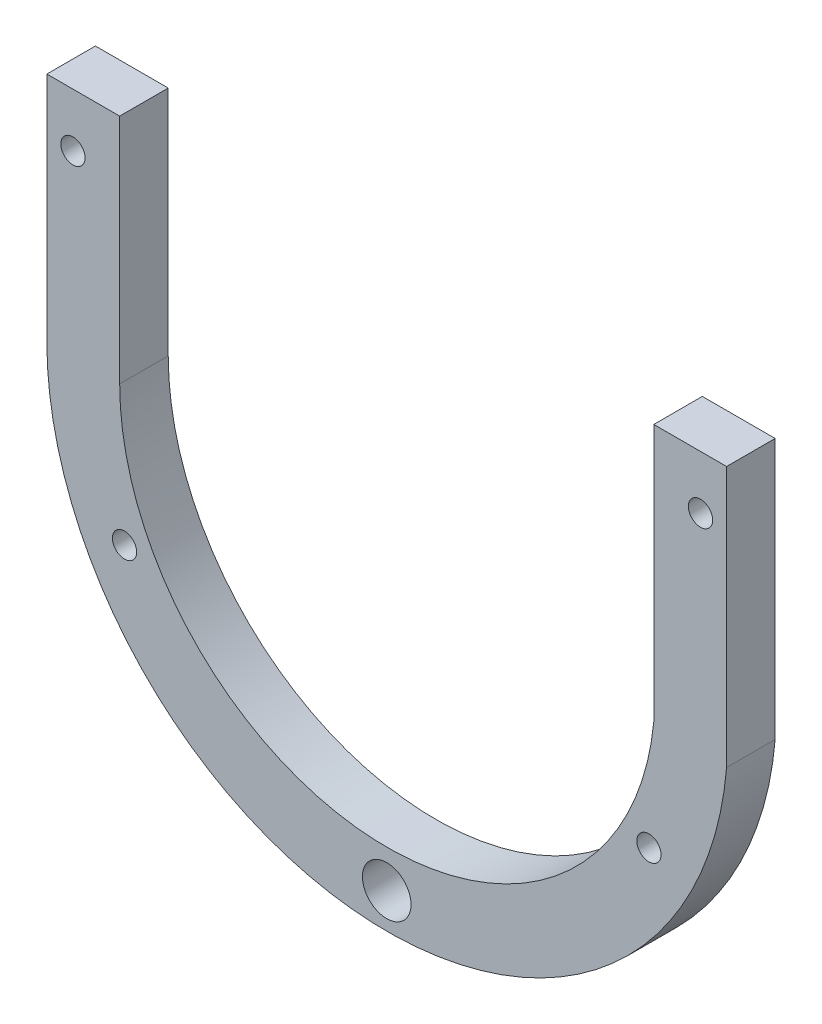
ISO-10303-21;
HEADER;
FILE_DESCRIPTION(('STEP AP214'),'2;1');
FILE_NAME('part.step','',(''),(''),'','','');
FILE_SCHEMA(('AUTOMOTIVE_DESIGN { 1 0 10303 214 1 1 1 1 }'));
ENDSEC;
DATA;
#1=APPLICATION_CONTEXT('core data for automotive mechanical design processes');
#2=APPLICATION_PROTOCOL_DEFINITION('international standard','automotive_design',2000,#1);
#3=PRODUCT_CONTEXT('',#1,'mechanical');
#4=PRODUCT('Part','Part','',(#3));
#5=PRODUCT_RELATED_PRODUCT_CATEGORY('part','',(#4));
#6=PRODUCT_DEFINITION_FORMATION('','',#4);
#7=PRODUCT_DEFINITION_CONTEXT('part definition',#1,'design');
#8=PRODUCT_DEFINITION('design','',#6,#7);
#9=PRODUCT_DEFINITION_SHAPE('','',#8);
#10=(LENGTH_UNIT() NAMED_UNIT(*) SI_UNIT(.MILLI.,.METRE.));
#11=(NAMED_UNIT(*) PLANE_ANGLE_UNIT() SI_UNIT($,.RADIAN.));
#12=(NAMED_UNIT(*) SI_UNIT($,.STERADIAN.) SOLID_ANGLE_UNIT());
#13=UNCERTAINTY_MEASURE_WITH_UNIT(LENGTH_MEASURE(1.E-05),#10,'distance_accuracy_value','');
#14=(GEOMETRIC_REPRESENTATION_CONTEXT(3) GLOBAL_UNCERTAINTY_ASSIGNED_CONTEXT((#13)) GLOBAL_UNIT_ASSIGNED_CONTEXT((#10,
#11,#12)) REPRESENTATION_CONTEXT('',''));
#15=CARTESIAN_POINT('',(0.,0.,0.));
#16=DIRECTION('',(0.,0.,1.));
#17=DIRECTION('',(1.,0.,0.));
#18=AXIS2_PLACEMENT_3D('',#15,#16,#17);
#19=CARTESIAN_POINT('',(0.,96.2099125364432,8.));
#20=DIRECTION('',(0.,-1.,0.));
#21=DIRECTION('',(0.,0.,-1.));
#22=AXIS2_PLACEMENT_3D('',#19,#20,#21);
#23=PLANE('',#22);
#24=DIRECTION('',(0.,0.,1.));
#25=VECTOR('',#24,1.);
#26=CARTESIAN_POINT('',(44.0000000000009,96.2099125364472,0.));
#27=LINE('',#26,#25);
#28=CARTESIAN_POINT('',(44.0000000000009,96.2099125364472,0.));
#29=VERTEX_POINT('',#28);
#30=CARTESIAN_POINT('',(44.0000000000009,96.2099125364472,8.));
#31=VERTEX_POINT('',#30);
#32=EDGE_CURVE('E147',#29,#31,#27,.T.);
#33=ORIENTED_EDGE('',*,*,#32,.T.);
#34=DIRECTION('',(-1.,0.,0.));
#35=VECTOR('',#34,1.);
#36=CARTESIAN_POINT('',(0.,96.2099125364432,8.));
#37=LINE('',#36,#35);
#38=CARTESIAN_POINT('',(56.0000000000009,96.2099125364472,8.));
#39=VERTEX_POINT('',#38);
#40=EDGE_CURVE('E43',#39,#31,#37,.T.);
#41=ORIENTED_EDGE('',*,*,#40,.F.);
#42=DIRECTION('',(0.,0.,1.));
#43=VECTOR('',#42,1.);
#44=CARTESIAN_POINT('',(56.0000000000009,96.2099125364472,0.));
#45=LINE('',#44,#43);
#46=CARTESIAN_POINT('',(56.0000000000009,96.2099125364472,0.));
#47=VERTEX_POINT('',#46);
#48=EDGE_CURVE('E150',#47,#39,#45,.T.);
#49=ORIENTED_EDGE('',*,*,#48,.F.);
#50=DIRECTION('',(-1.,0.,0.));
#51=VECTOR('',#50,1.);
#52=CARTESIAN_POINT('',(0.,96.2099125364432,0.));
#53=LINE('',#52,#51);
#54=EDGE_CURVE('E38',#47,#29,#53,.T.);
#55=ORIENTED_EDGE('',*,*,#54,.T.);
#56=EDGE_LOOP('',(#33,#41,#49,#55));
#57=FACE_BOUND('',#56,.T.);
#58=ADVANCED_FACE('F35',(#57),#23,.F.);
#59=DIRECTION('',(0.,0.,1.));
#60=VECTOR('',#59,1.);
#61=CARTESIAN_POINT('',(144.000000000001,96.2099125364472,0.));
#62=LINE('',#61,#60);
#63=CARTESIAN_POINT('',(144.000000000001,96.2099125364432,0.));
#64=VERTEX_POINT('',#63);
#65=CARTESIAN_POINT('',(144.000000000001,96.2099125364472,8.));
#66=VERTEX_POINT('',#65);
#67=EDGE_CURVE('E58',#64,#66,#62,.T.);
#68=ORIENTED_EDGE('',*,*,#67,.T.);
#69=CARTESIAN_POINT('',(156.000000000001,96.2099125364472,8.));
#70=VERTEX_POINT('',#69);
#71=EDGE_CURVE('E12',#70,#66,#37,.T.);
#72=ORIENTED_EDGE('',*,*,#71,.F.);
#73=DIRECTION('',(0.,0.,1.));
#74=VECTOR('',#73,1.);
#75=CARTESIAN_POINT('',(156.000000000001,96.2099125364472,0.));
#76=LINE('',#75,#74);
#77=CARTESIAN_POINT('',(156.000000000001,96.2099125364472,0.));
#78=VERTEX_POINT('',#77);
#79=EDGE_CURVE('E154',#78,#70,#76,.T.);
#80=ORIENTED_EDGE('',*,*,#79,.F.);
#81=EDGE_CURVE('E157',#78,#64,#53,.T.);
#82=ORIENTED_EDGE('',*,*,#81,.T.);
#83=EDGE_LOOP('',(#68,#72,#80,#82));
#84=FACE_BOUND('',#83,.T.);
#85=ADVANCED_FACE('F176',(#84),#23,.F.);
#86=CARTESIAN_POINT('',(0.,0.,8.));
#87=DIRECTION('',(0.,0.,-1.));
#88=DIRECTION('',(-1.,0.,0.));
#89=AXIS2_PLACEMENT_3D('',#86,#87,#88);
#90=PLANE('',#89);
#91=CARTESIAN_POINT('',(100.000000000001,7.69234039701383,8.));
#92=DIRECTION('',(0.,0.,-1.));
#93=DIRECTION('',(-1.,0.,0.));
#94=AXIS2_PLACEMENT_3D('',#91,#92,#93);
#95=CIRCLE('',#94,4.00000000000001);
#96=CARTESIAN_POINT('',(96.000000000001,7.69234039701383,8.));
#97=VERTEX_POINT('',#96);
#98=EDGE_CURVE('E202',#97,#97,#95,.T.);
#99=ORIENTED_EDGE('',*,*,#98,.T.);
#100=EDGE_LOOP('',(#99));
#101=FACE_BOUND('',#100,.T.);
#102=CARTESIAN_POINT('',(151.700000000002,87.3923403970137,8.));
#103=DIRECTION('',(0.,0.,-1.));
#104=DIRECTION('',(-1.,0.,0.));
#105=AXIS2_PLACEMENT_3D('',#102,#103,#104);
#106=CIRCLE('',#105,1.99999999999814);
#107=CARTESIAN_POINT('',(149.700000000004,87.3923403970137,8.));
#108=VERTEX_POINT('',#107);
#109=EDGE_CURVE('E196',#108,#108,#106,.T.);
#110=ORIENTED_EDGE('',*,*,#109,.T.);
#111=EDGE_LOOP('',(#110));
#112=FACE_BOUND('',#111,.T.);
#113=CARTESIAN_POINT('',(143.2,35.3923403970135,8.));
#114=DIRECTION('',(0.,0.,-1.));
#115=DIRECTION('',(-1.,0.,0.));
#116=AXIS2_PLACEMENT_3D('',#113,#114,#115);
#117=CIRCLE('',#116,1.99999999999811);
#118=CARTESIAN_POINT('',(141.200000000002,35.3923403970135,8.));
#119=VERTEX_POINT('',#118);
#120=EDGE_CURVE('E190',#119,#119,#117,.T.);
#121=ORIENTED_EDGE('',*,*,#120,.T.);
#122=EDGE_LOOP('',(#121));
#123=FACE_BOUND('',#122,.T.);
#124=CARTESIAN_POINT('',(56.8,35.3923403970135,8.));
#125=DIRECTION('',(0.,0.,-1.));
#126=DIRECTION('',(-1.,0.,0.));
#127=AXIS2_PLACEMENT_3D('',#124,#125,#126);
#128=CIRCLE('',#127,1.99999999999814);
#129=CARTESIAN_POINT('',(54.8000000000019,35.3923403970135,8.));
#130=VERTEX_POINT('',#129);
#131=EDGE_CURVE('E184',#130,#130,#128,.T.);
#132=ORIENTED_EDGE('',*,*,#131,.T.);
#133=EDGE_LOOP('',(#132));
#134=FACE_BOUND('',#133,.T.);
#135=CARTESIAN_POINT('',(48.3000000000017,87.3923403970138,8.));
#136=DIRECTION('',(0.,0.,-1.));
#137=DIRECTION('',(-1.,0.,0.));
#138=AXIS2_PLACEMENT_3D('',#135,#136,#137);
#139=CIRCLE('',#138,1.99999999999813);
#140=CARTESIAN_POINT('',(46.3000000000035,87.3923403970138,8.));
#141=VERTEX_POINT('',#140);
#142=EDGE_CURVE('E133',#141,#141,#139,.T.);
#143=ORIENTED_EDGE('',*,*,#142,.T.);
#144=EDGE_LOOP('',(#143));
#145=FACE_BOUND('',#144,.T.);
#146=DIRECTION('',(0.,1.,0.));
#147=VECTOR('',#146,1.);
#148=CARTESIAN_POINT('',(56.0000000000009,57.9923403970145,8.));
#149=LINE('',#148,#147);
#150=CARTESIAN_POINT('',(56.0000000000009,57.9923403970145,8.));
#151=VERTEX_POINT('',#150);
#152=EDGE_CURVE('E139',#151,#39,#149,.T.);
#153=ORIENTED_EDGE('',*,*,#152,.T.);
#154=ORIENTED_EDGE('',*,*,#40,.T.);
#155=DIRECTION('',(0.,-1.,0.));
#156=VECTOR('',#155,1.);
#157=CARTESIAN_POINT('',(44.0000000000017,57.9923403970145,8.));
#158=LINE('',#157,#156);
#159=CARTESIAN_POINT('',(44.0000000000017,57.9923403970145,8.));
#160=VERTEX_POINT('',#159);
#161=EDGE_CURVE('E142',#31,#160,#158,.T.);
#162=ORIENTED_EDGE('',*,*,#161,.T.);
#163=CARTESIAN_POINT('',(100.100000000001,57.9923403970145,8.));
#164=DIRECTION('',(0.,0.,1.));
#165=DIRECTION('',(1.,0.,0.));
#166=AXIS2_PLACEMENT_3D('',#163,#164,#165);
#167=CIRCLE('',#166,56.1);
#168=CARTESIAN_POINT('',(156.000000000002,53.2594765705346,8.));
#169=VERTEX_POINT('',#168);
#170=EDGE_CURVE('E129',#160,#169,#167,.T.);
#171=ORIENTED_EDGE('',*,*,#170,.T.);
#172=DIRECTION('',(0.,1.,0.));
#173=VECTOR('',#172,1.);
#174=CARTESIAN_POINT('',(156.000000000001,96.2099125364472,8.));
#175=LINE('',#174,#173);
#176=EDGE_CURVE('E132',#169,#70,#175,.T.);
#177=ORIENTED_EDGE('',*,*,#176,.T.);
#178=ORIENTED_EDGE('',*,*,#71,.T.);
#179=DIRECTION('',(0.,-1.,0.));
#180=VECTOR('',#179,1.);
#181=CARTESIAN_POINT('',(144.000000000001,96.2099125364472,8.));
#182=LINE('',#181,#180);
#183=CARTESIAN_POINT('',(144.000000000001,53.7971050043338,8.));
#184=VERTEX_POINT('',#183);
#185=EDGE_CURVE('E136',#66,#184,#182,.T.);
#186=ORIENTED_EDGE('',*,*,#185,.T.);
#187=CARTESIAN_POINT('',(100.100000000001,57.9923403970145,8.));
#188=DIRECTION('',(0.,0.,-1.));
#189=DIRECTION('',(1.,0.,0.));
#190=AXIS2_PLACEMENT_3D('',#187,#188,#189);
#191=CIRCLE('',#190,44.1);
#192=EDGE_CURVE('E107',#184,#151,#191,.T.);
#193=ORIENTED_EDGE('',*,*,#192,.T.);
#194=EDGE_LOOP('',(#153,#154,#162,#171,#177,#178,#186,#193));
#195=FACE_BOUND('',#194,.T.);
#196=ADVANCED_FACE('F170',(#101,#112,#123,#134,#145,#195),#90,.F.);
#197=CARTESIAN_POINT('',(0.,0.,0.));
#198=DIRECTION('',(0.,0.,-1.));
#199=DIRECTION('',(-1.,0.,0.));
#200=AXIS2_PLACEMENT_3D('',#197,#198,#199);
#201=PLANE('',#200);
#202=CARTESIAN_POINT('',(100.000000000001,7.69234039701383,0.));
#203=DIRECTION('',(0.,0.,1.));
#204=DIRECTION('',(1.,0.,0.));
#205=AXIS2_PLACEMENT_3D('',#202,#203,#204);
#206=CIRCLE('',#205,4.00000000000001);
#207=CARTESIAN_POINT('',(104.000000000001,7.69234039701383,0.));
#208=VERTEX_POINT('',#207);
#209=EDGE_CURVE('E205',#208,#208,#206,.T.);
#210=ORIENTED_EDGE('',*,*,#209,.T.);
#211=EDGE_LOOP('',(#210));
#212=FACE_BOUND('',#211,.T.);
#213=CARTESIAN_POINT('',(151.700000000002,87.3923403970137,0.));
#214=DIRECTION('',(0.,0.,1.));
#215=DIRECTION('',(1.,0.,0.));
#216=AXIS2_PLACEMENT_3D('',#213,#214,#215);
#217=CIRCLE('',#216,1.99999999999814);
#218=CARTESIAN_POINT('',(153.7,87.3923403970137,0.));
#219=VERTEX_POINT('',#218);
#220=EDGE_CURVE('E199',#219,#219,#217,.T.);
#221=ORIENTED_EDGE('',*,*,#220,.T.);
#222=EDGE_LOOP('',(#221));
#223=FACE_BOUND('',#222,.T.);
#224=CARTESIAN_POINT('',(143.2,35.3923403970135,0.));
#225=DIRECTION('',(0.,0.,1.));
#226=DIRECTION('',(1.,0.,0.));
#227=AXIS2_PLACEMENT_3D('',#224,#225,#226);
#228=CIRCLE('',#227,1.99999999999811);
#229=CARTESIAN_POINT('',(145.199999999998,35.3923403970135,0.));
#230=VERTEX_POINT('',#229);
#231=EDGE_CURVE('E193',#230,#230,#228,.T.);
#232=ORIENTED_EDGE('',*,*,#231,.T.);
#233=EDGE_LOOP('',(#232));
#234=FACE_BOUND('',#233,.T.);
#235=CARTESIAN_POINT('',(56.8,35.3923403970135,0.));
#236=DIRECTION('',(0.,0.,1.));
#237=DIRECTION('',(1.,0.,0.));
#238=AXIS2_PLACEMENT_3D('',#235,#236,#237);
#239=CIRCLE('',#238,1.99999999999814);
#240=CARTESIAN_POINT('',(58.7999999999981,35.3923403970135,0.));
#241=VERTEX_POINT('',#240);
#242=EDGE_CURVE('E187',#241,#241,#239,.T.);
#243=ORIENTED_EDGE('',*,*,#242,.T.);
#244=EDGE_LOOP('',(#243));
#245=FACE_BOUND('',#244,.T.);
#246=CARTESIAN_POINT('',(48.3000000000017,87.3923403970138,0.));
#247=DIRECTION('',(0.,0.,1.));
#248=DIRECTION('',(1.,0.,0.));
#249=AXIS2_PLACEMENT_3D('',#246,#247,#248);
#250=CIRCLE('',#249,1.99999999999813);
#251=CARTESIAN_POINT('',(50.2999999999998,87.3923403970138,0.));
#252=VERTEX_POINT('',#251);
#253=EDGE_CURVE('E181',#252,#252,#250,.T.);
#254=ORIENTED_EDGE('',*,*,#253,.T.);
#255=EDGE_LOOP('',(#254));
#256=FACE_BOUND('',#255,.T.);
#257=ORIENTED_EDGE('',*,*,#54,.F.);
#258=DIRECTION('',(0.,1.,0.));
#259=VECTOR('',#258,1.);
#260=CARTESIAN_POINT('',(56.0000000000009,57.9923403970145,0.));
#261=LINE('',#260,#259);
#262=CARTESIAN_POINT('',(56.0000000000009,57.9923403970145,0.));
#263=VERTEX_POINT('',#262);
#264=EDGE_CURVE('E120',#263,#47,#261,.T.);
#265=ORIENTED_EDGE('',*,*,#264,.F.);
#266=CARTESIAN_POINT('',(100.100000000001,57.9923403970145,0.));
#267=DIRECTION('',(0.,0.,-1.));
#268=DIRECTION('',(1.,0.,0.));
#269=AXIS2_PLACEMENT_3D('',#266,#267,#268);
#270=CIRCLE('',#269,44.1);
#271=CARTESIAN_POINT('',(144.000000000001,53.7971050043338,0.));
#272=VERTEX_POINT('',#271);
#273=EDGE_CURVE('E104',#272,#263,#270,.T.);
#274=ORIENTED_EDGE('',*,*,#273,.F.);
#275=DIRECTION('',(0.,-1.,0.));
#276=VECTOR('',#275,1.);
#277=CARTESIAN_POINT('',(144.000000000001,96.2099125364472,0.));
#278=LINE('',#277,#276);
#279=EDGE_CURVE('E111',#64,#272,#278,.T.);
#280=ORIENTED_EDGE('',*,*,#279,.F.);
#281=ORIENTED_EDGE('',*,*,#81,.F.);
#282=DIRECTION('',(0.,1.,0.));
#283=VECTOR('',#282,1.);
#284=CARTESIAN_POINT('',(156.000000000001,96.2099125364472,0.));
#285=LINE('',#284,#283);
#286=CARTESIAN_POINT('',(156.000000000002,53.2594765705346,0.));
#287=VERTEX_POINT('',#286);
#288=EDGE_CURVE('E116',#287,#78,#285,.T.);
#289=ORIENTED_EDGE('',*,*,#288,.F.);
#290=CARTESIAN_POINT('',(100.100000000001,57.9923403970145,0.));
#291=DIRECTION('',(0.,0.,1.));
#292=DIRECTION('',(1.,0.,0.));
#293=AXIS2_PLACEMENT_3D('',#290,#291,#292);
#294=CIRCLE('',#293,56.1);
#295=CARTESIAN_POINT('',(44.0000000000017,57.9923403970145,0.));
#296=VERTEX_POINT('',#295);
#297=EDGE_CURVE('E50',#296,#287,#294,.T.);
#298=ORIENTED_EDGE('',*,*,#297,.F.);
#299=DIRECTION('',(0.,-1.,0.));
#300=VECTOR('',#299,1.);
#301=CARTESIAN_POINT('',(44.0000000000017,57.9923403970145,0.));
#302=LINE('',#301,#300);
#303=EDGE_CURVE('E122',#29,#296,#302,.T.);
#304=ORIENTED_EDGE('',*,*,#303,.F.);
#305=EDGE_LOOP('',(#257,#265,#274,#280,#281,#289,#298,#304));
#306=FACE_BOUND('',#305,.T.);
#307=ADVANCED_FACE('F119',(#212,#223,#234,#245,#256,#306),#201,.T.);
#308=CARTESIAN_POINT('',(44.0000000000017,57.9923403970145,0.));
#309=DIRECTION('',(-1.,0.,0.));
#310=DIRECTION('',(0.,-1.,0.));
#311=AXIS2_PLACEMENT_3D('',#308,#309,#310);
#312=PLANE('',#311);
#313=ORIENTED_EDGE('',*,*,#161,.F.);
#314=ORIENTED_EDGE('',*,*,#32,.F.);
#315=ORIENTED_EDGE('',*,*,#303,.T.);
#316=DIRECTION('',(0.,0.,1.));
#317=VECTOR('',#316,1.);
#318=CARTESIAN_POINT('',(44.0000000000017,57.9923403970145,0.));
#319=LINE('',#318,#317);
#320=EDGE_CURVE('E145',#296,#160,#319,.T.);
#321=ORIENTED_EDGE('',*,*,#320,.T.);
#322=EDGE_LOOP('',(#313,#314,#315,#321));
#323=FACE_BOUND('',#322,.T.);
#324=ADVANCED_FACE('F168',(#323),#312,.T.);
#325=CARTESIAN_POINT('',(156.000000000001,96.2099125364472,0.));
#326=DIRECTION('',(1.,0.,0.));
#327=DIRECTION('',(0.,1.,0.));
#328=AXIS2_PLACEMENT_3D('',#325,#326,#327);
#329=PLANE('',#328);
#330=ORIENTED_EDGE('',*,*,#176,.F.);
#331=DIRECTION('',(0.,0.,1.));
#332=VECTOR('',#331,1.);
#333=CARTESIAN_POINT('',(156.000000000002,53.2594765705346,0.));
#334=LINE('',#333,#332);
#335=EDGE_CURVE('E128',#287,#169,#334,.T.);
#336=ORIENTED_EDGE('',*,*,#335,.F.);
#337=ORIENTED_EDGE('',*,*,#288,.T.);
#338=ORIENTED_EDGE('',*,*,#79,.T.);
#339=EDGE_LOOP('',(#330,#336,#337,#338));
#340=FACE_BOUND('',#339,.T.);
#341=ADVANCED_FACE('F175',(#340),#329,.T.);
#342=CARTESIAN_POINT('',(100.100000000001,57.9923403970145,0.));
#343=DIRECTION('',(0.,0.,1.));
#344=DIRECTION('',(1.,0.,0.));
#345=AXIS2_PLACEMENT_3D('',#342,#343,#344);
#346=CYLINDRICAL_SURFACE('',#345,56.1);
#347=ORIENTED_EDGE('',*,*,#170,.F.);
#348=ORIENTED_EDGE('',*,*,#320,.F.);
#349=ORIENTED_EDGE('',*,*,#297,.T.);
#350=ORIENTED_EDGE('',*,*,#335,.T.);
#351=EDGE_LOOP('',(#347,#348,#349,#350));
#352=FACE_BOUND('',#351,.T.);
#353=ADVANCED_FACE('F173',(#352),#346,.T.);
#354=CARTESIAN_POINT('',(56.0000000000009,57.9923403970145,0.));
#355=DIRECTION('',(1.,0.,0.));
#356=DIRECTION('',(0.,1.,0.));
#357=AXIS2_PLACEMENT_3D('',#354,#355,#356);
#358=PLANE('',#357);
#359=ORIENTED_EDGE('',*,*,#152,.F.);
#360=DIRECTION('',(0.,0.,1.));
#361=VECTOR('',#360,1.);
#362=CARTESIAN_POINT('',(56.0000000000009,57.9923403970145,0.));
#363=LINE('',#362,#361);
#364=EDGE_CURVE('E109',#263,#151,#363,.T.);
#365=ORIENTED_EDGE('',*,*,#364,.F.);
#366=ORIENTED_EDGE('',*,*,#264,.T.);
#367=ORIENTED_EDGE('',*,*,#48,.T.);
#368=EDGE_LOOP('',(#359,#365,#366,#367));
#369=FACE_BOUND('',#368,.T.);
#370=ADVANCED_FACE('F277',(#369),#358,.T.);
#371=CARTESIAN_POINT('',(100.100000000001,57.9923403970145,0.));
#372=DIRECTION('',(0.,0.,1.));
#373=DIRECTION('',(1.,0.,0.));
#374=AXIS2_PLACEMENT_3D('',#371,#372,#373);
#375=CYLINDRICAL_SURFACE('',#374,44.1);
#376=ORIENTED_EDGE('',*,*,#192,.F.);
#377=DIRECTION('',(0.,0.,1.));
#378=VECTOR('',#377,1.);
#379=CARTESIAN_POINT('',(144.000000000001,53.7971050043338,0.));
#380=LINE('',#379,#378);
#381=EDGE_CURVE('E101',#272,#184,#380,.T.);
#382=ORIENTED_EDGE('',*,*,#381,.F.);
#383=ORIENTED_EDGE('',*,*,#273,.T.);
#384=ORIENTED_EDGE('',*,*,#364,.T.);
#385=EDGE_LOOP('',(#376,#382,#383,#384));
#386=FACE_BOUND('',#385,.T.);
#387=ADVANCED_FACE('F102',(#386),#375,.F.);
#388=CARTESIAN_POINT('',(144.000000000001,96.2099125364472,0.));
#389=DIRECTION('',(-1.,0.,0.));
#390=DIRECTION('',(0.,0.,1.));
#391=AXIS2_PLACEMENT_3D('',#388,#389,#390);
#392=PLANE('',#391);
#393=ORIENTED_EDGE('',*,*,#185,.F.);
#394=ORIENTED_EDGE('',*,*,#67,.F.);
#395=ORIENTED_EDGE('',*,*,#279,.T.);
#396=ORIENTED_EDGE('',*,*,#381,.T.);
#397=EDGE_LOOP('',(#393,#394,#395,#396));
#398=FACE_BOUND('',#397,.T.);
#399=ADVANCED_FACE('F112',(#398),#392,.T.);
#400=CARTESIAN_POINT('',(48.3000000000017,87.3923403970138,0.));
#401=DIRECTION('',(0.,0.,1.));
#402=DIRECTION('',(1.,0.,0.));
#403=AXIS2_PLACEMENT_3D('',#400,#401,#402);
#404=CYLINDRICAL_SURFACE('',#403,1.99999999999813);
#405=ORIENTED_EDGE('',*,*,#253,.F.);
#406=EDGE_LOOP('',(#405));
#407=FACE_BOUND('',#406,.T.);
#408=ORIENTED_EDGE('',*,*,#142,.F.);
#409=EDGE_LOOP('',(#408));
#410=FACE_BOUND('',#409,.T.);
#411=ADVANCED_FACE('F229',(#407,#410),#404,.F.);
#412=CARTESIAN_POINT('',(56.8,35.3923403970135,0.));
#413=DIRECTION('',(0.,0.,1.));
#414=DIRECTION('',(1.,0.,0.));
#415=AXIS2_PLACEMENT_3D('',#412,#413,#414);
#416=CYLINDRICAL_SURFACE('',#415,1.99999999999814);
#417=ORIENTED_EDGE('',*,*,#242,.F.);
#418=EDGE_LOOP('',(#417));
#419=FACE_BOUND('',#418,.T.);
#420=ORIENTED_EDGE('',*,*,#131,.F.);
#421=EDGE_LOOP('',(#420));
#422=FACE_BOUND('',#421,.T.);
#423=ADVANCED_FACE('F231',(#419,#422),#416,.F.);
#424=CARTESIAN_POINT('',(143.2,35.3923403970135,0.));
#425=DIRECTION('',(0.,0.,1.));
#426=DIRECTION('',(1.,0.,0.));
#427=AXIS2_PLACEMENT_3D('',#424,#425,#426);
#428=CYLINDRICAL_SURFACE('',#427,1.99999999999811);
#429=ORIENTED_EDGE('',*,*,#231,.F.);
#430=EDGE_LOOP('',(#429));
#431=FACE_BOUND('',#430,.T.);
#432=ORIENTED_EDGE('',*,*,#120,.F.);
#433=EDGE_LOOP('',(#432));
#434=FACE_BOUND('',#433,.T.);
#435=ADVANCED_FACE('F238',(#431,#434),#428,.F.);
#436=CARTESIAN_POINT('',(151.700000000002,87.3923403970137,0.));
#437=DIRECTION('',(0.,0.,1.));
#438=DIRECTION('',(1.,0.,0.));
#439=AXIS2_PLACEMENT_3D('',#436,#437,#438);
#440=CYLINDRICAL_SURFACE('',#439,1.99999999999814);
#441=ORIENTED_EDGE('',*,*,#220,.F.);
#442=EDGE_LOOP('',(#441));
#443=FACE_BOUND('',#442,.T.);
#444=ORIENTED_EDGE('',*,*,#109,.F.);
#445=EDGE_LOOP('',(#444));
#446=FACE_BOUND('',#445,.T.);
#447=ADVANCED_FACE('F214',(#443,#446),#440,.F.);
#448=CARTESIAN_POINT('',(100.000000000001,7.69234039701383,0.));
#449=DIRECTION('',(0.,0.,1.));
#450=DIRECTION('',(1.,0.,0.));
#451=AXIS2_PLACEMENT_3D('',#448,#449,#450);
#452=CYLINDRICAL_SURFACE('',#451,4.00000000000001);
#453=ORIENTED_EDGE('',*,*,#209,.F.);
#454=EDGE_LOOP('',(#453));
#455=FACE_BOUND('',#454,.T.);
#456=ORIENTED_EDGE('',*,*,#98,.F.);
#457=EDGE_LOOP('',(#456));
#458=FACE_BOUND('',#457,.T.);
#459=ADVANCED_FACE('F211',(#455,#458),#452,.F.);
#460=CLOSED_SHELL('',(#58,#85,#196,#307,#324,#341,#353,#370,#387,#399,#411,#423,#435,#447,#459));
#461=MANIFOLD_SOLID_BREP('B2',#460);
#462=ADVANCED_BREP_SHAPE_REPRESENTATION('',(#18,#461),#14);
#463=SHAPE_DEFINITION_REPRESENTATION(#9,#462);
ENDSEC;
END-ISO-10303-21;
